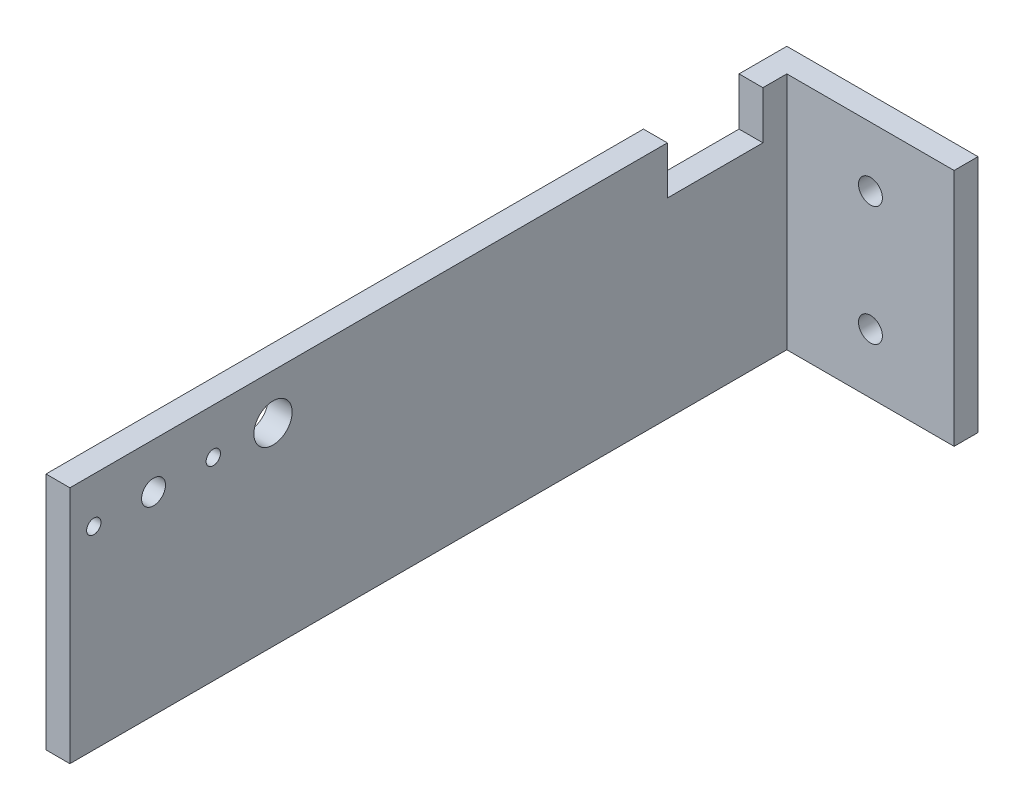
ISO-10303-21;
HEADER;
FILE_DESCRIPTION(('STEP AP214'),'2;1');
FILE_NAME('part.step','',(''),(''),'','','');
FILE_SCHEMA(('AUTOMOTIVE_DESIGN { 1 0 10303 214 1 1 1 1 }'));
ENDSEC;
DATA;
#1=APPLICATION_CONTEXT('core data for automotive mechanical design processes');
#2=APPLICATION_PROTOCOL_DEFINITION('international standard','automotive_design',2000,#1);
#3=PRODUCT_CONTEXT('',#1,'mechanical');
#4=PRODUCT('Part','Part','',(#3));
#5=PRODUCT_RELATED_PRODUCT_CATEGORY('part','',(#4));
#6=PRODUCT_DEFINITION_FORMATION('','',#4);
#7=PRODUCT_DEFINITION_CONTEXT('part definition',#1,'design');
#8=PRODUCT_DEFINITION('design','',#6,#7);
#9=PRODUCT_DEFINITION_SHAPE('','',#8);
#10=(LENGTH_UNIT() NAMED_UNIT(*) SI_UNIT(.MILLI.,.METRE.));
#11=(NAMED_UNIT(*) PLANE_ANGLE_UNIT() SI_UNIT($,.RADIAN.));
#12=(NAMED_UNIT(*) SI_UNIT($,.STERADIAN.) SOLID_ANGLE_UNIT());
#13=UNCERTAINTY_MEASURE_WITH_UNIT(LENGTH_MEASURE(1.E-05),#10,'distance_accuracy_value','');
#14=(GEOMETRIC_REPRESENTATION_CONTEXT(3) GLOBAL_UNCERTAINTY_ASSIGNED_CONTEXT((#13)) GLOBAL_UNIT_ASSIGNED_CONTEXT((#10,
#11,#12)) REPRESENTATION_CONTEXT('',''));
#15=CARTESIAN_POINT('',(0.,0.,0.));
#16=DIRECTION('',(0.,0.,1.));
#17=DIRECTION('',(1.,0.,0.));
#18=AXIS2_PLACEMENT_3D('',#15,#16,#17);
#19=CARTESIAN_POINT('',(0.,25.,0.));
#20=DIRECTION('',(0.,1.,0.));
#21=DIRECTION('',(0.,0.,1.));
#22=AXIS2_PLACEMENT_3D('',#19,#20,#21);
#23=PLANE('',#22);
#24=DIRECTION('',(1.,0.,0.));
#25=VECTOR('',#24,1.);
#26=CARTESIAN_POINT('',(-0.00100000000000013,25.,-145.));
#27=LINE('',#26,#25);
#28=CARTESIAN_POINT('',(0.,25.,-145.));
#29=VERTEX_POINT('',#28);
#30=CARTESIAN_POINT('',(5.00000000000002,25.,-145.));
#31=VERTEX_POINT('',#30);
#32=EDGE_CURVE('E194',#29,#31,#27,.T.);
#33=ORIENTED_EDGE('',*,*,#32,.T.);
#34=DIRECTION('',(0.,0.,-1.));
#35=VECTOR('',#34,1.);
#36=CARTESIAN_POINT('',(5.00000000000002,25.,0.));
#37=LINE('',#36,#35);
#38=CARTESIAN_POINT('',(5.00000000000002,25.,-150.));
#39=VERTEX_POINT('',#38);
#40=EDGE_CURVE('E109',#31,#39,#37,.T.);
#41=ORIENTED_EDGE('',*,*,#40,.T.);
#42=DIRECTION('',(1.,0.,0.));
#43=VECTOR('',#42,1.);
#44=CARTESIAN_POINT('',(5.00000000000002,25.,-150.));
#45=LINE('',#44,#43);
#46=CARTESIAN_POINT('',(40.,25.,-150.));
#47=VERTEX_POINT('',#46);
#48=EDGE_CURVE('E102',#39,#47,#45,.T.);
#49=ORIENTED_EDGE('',*,*,#48,.T.);
#50=DIRECTION('',(0.,0.,-1.));
#51=VECTOR('',#50,1.);
#52=CARTESIAN_POINT('',(40.,25.,-150.));
#53=LINE('',#52,#51);
#54=CARTESIAN_POINT('',(40.,25.,-155.));
#55=VERTEX_POINT('',#54);
#56=EDGE_CURVE('E106',#47,#55,#53,.T.);
#57=ORIENTED_EDGE('',*,*,#56,.T.);
#58=DIRECTION('',(-1.,0.,0.));
#59=VECTOR('',#58,1.);
#60=CARTESIAN_POINT('',(40.,25.,-155.));
#61=LINE('',#60,#59);
#62=CARTESIAN_POINT('',(0.,25.,-155.));
#63=VERTEX_POINT('',#62);
#64=EDGE_CURVE('E57',#55,#63,#61,.T.);
#65=ORIENTED_EDGE('',*,*,#64,.T.);
#66=DIRECTION('',(0.,0.,1.));
#67=VECTOR('',#66,1.);
#68=CARTESIAN_POINT('',(0.,25.,-155.));
#69=LINE('',#68,#67);
#70=EDGE_CURVE('E161',#63,#29,#69,.T.);
#71=ORIENTED_EDGE('',*,*,#70,.T.);
#72=EDGE_LOOP('',(#33,#41,#49,#57,#65,#71));
#73=FACE_BOUND('',#72,.T.);
#74=ADVANCED_FACE('F33',(#73),#23,.T.);
#75=CARTESIAN_POINT('',(0.,25.,-155.));
#76=DIRECTION('',(1.,0.,0.));
#77=DIRECTION('',(0.,0.,-1.));
#78=AXIS2_PLACEMENT_3D('',#75,#76,#77);
#79=PLANE('',#78);
#80=CARTESIAN_POINT('',(0.,15.5,-5.));
#81=DIRECTION('',(1.,0.,0.));
#82=DIRECTION('',(0.,0.,-1.));
#83=AXIS2_PLACEMENT_3D('',#80,#81,#82);
#84=CIRCLE('',#83,1.5);
#85=CARTESIAN_POINT('',(0.,15.5,-6.5));
#86=VERTEX_POINT('',#85);
#87=EDGE_CURVE('E135',#86,#86,#84,.F.);
#88=ORIENTED_EDGE('',*,*,#87,.F.);
#89=EDGE_LOOP('',(#88));
#90=FACE_BOUND('',#89,.T.);
#91=CARTESIAN_POINT('',(0.,15.5,-17.5));
#92=DIRECTION('',(1.,0.,0.));
#93=DIRECTION('',(0.,0.,-1.));
#94=AXIS2_PLACEMENT_3D('',#91,#92,#93);
#95=CIRCLE('',#94,2.5);
#96=CARTESIAN_POINT('',(0.,15.5,-20.));
#97=VERTEX_POINT('',#96);
#98=EDGE_CURVE('E226',#97,#97,#95,.F.);
#99=ORIENTED_EDGE('',*,*,#98,.F.);
#100=EDGE_LOOP('',(#99));
#101=FACE_BOUND('',#100,.T.);
#102=CARTESIAN_POINT('',(0.,15.5,-30.));
#103=DIRECTION('',(1.,0.,0.));
#104=DIRECTION('',(0.,0.,-1.));
#105=AXIS2_PLACEMENT_3D('',#102,#103,#104);
#106=CIRCLE('',#105,1.50000000000001);
#107=CARTESIAN_POINT('',(0.,15.5,-31.5));
#108=VERTEX_POINT('',#107);
#109=EDGE_CURVE('E220',#108,#108,#106,.F.);
#110=ORIENTED_EDGE('',*,*,#109,.F.);
#111=EDGE_LOOP('',(#110));
#112=FACE_BOUND('',#111,.T.);
#113=CARTESIAN_POINT('',(0.,15.5,-42.5));
#114=DIRECTION('',(1.,0.,0.));
#115=DIRECTION('',(0.,0.,-1.));
#116=AXIS2_PLACEMENT_3D('',#113,#114,#115);
#117=CIRCLE('',#116,4.);
#118=CARTESIAN_POINT('',(0.,15.5,-46.5));
#119=VERTEX_POINT('',#118);
#120=EDGE_CURVE('E214',#119,#119,#117,.F.);
#121=ORIENTED_EDGE('',*,*,#120,.F.);
#122=EDGE_LOOP('',(#121));
#123=FACE_BOUND('',#122,.T.);
#124=DIRECTION('',(0.,0.,1.));
#125=VECTOR('',#124,1.);
#126=CARTESIAN_POINT('',(0.,15.,-125.));
#127=LINE('',#126,#125);
#128=CARTESIAN_POINT('',(0.,15.,-145.));
#129=VERTEX_POINT('',#128);
#130=CARTESIAN_POINT('',(0.,15.,-125.));
#131=VERTEX_POINT('',#130);
#132=EDGE_CURVE('E211',#129,#131,#127,.T.);
#133=ORIENTED_EDGE('',*,*,#132,.F.);
#134=DIRECTION('',(0.,-1.,0.));
#135=VECTOR('',#134,1.);
#136=CARTESIAN_POINT('',(0.,15.,-145.));
#137=LINE('',#136,#135);
#138=EDGE_CURVE('E164',#29,#129,#137,.T.);
#139=ORIENTED_EDGE('',*,*,#138,.F.);
#140=ORIENTED_EDGE('',*,*,#70,.F.);
#141=DIRECTION('',(0.,-1.,0.));
#142=VECTOR('',#141,1.);
#143=CARTESIAN_POINT('',(0.,25.,-155.));
#144=LINE('',#143,#142);
#145=CARTESIAN_POINT('',(0.,-25.,-155.));
#146=VERTEX_POINT('',#145);
#147=EDGE_CURVE('E127',#63,#146,#144,.T.);
#148=ORIENTED_EDGE('',*,*,#147,.T.);
#149=DIRECTION('',(0.,0.,1.));
#150=VECTOR('',#149,1.);
#151=CARTESIAN_POINT('',(0.,-25.,-155.));
#152=LINE('',#151,#150);
#153=CARTESIAN_POINT('',(0.,-25.,0.));
#154=VERTEX_POINT('',#153);
#155=EDGE_CURVE('E131',#146,#154,#152,.T.);
#156=ORIENTED_EDGE('',*,*,#155,.T.);
#157=DIRECTION('',(0.,-1.,0.));
#158=VECTOR('',#157,1.);
#159=CARTESIAN_POINT('',(0.,25.,0.));
#160=LINE('',#159,#158);
#161=CARTESIAN_POINT('',(0.,25.,0.));
#162=VERTEX_POINT('',#161);
#163=EDGE_CURVE('E11',#162,#154,#160,.T.);
#164=ORIENTED_EDGE('',*,*,#163,.F.);
#165=CARTESIAN_POINT('',(0.,25.,-125.));
#166=VERTEX_POINT('',#165);
#167=EDGE_CURVE('E92',#166,#162,#69,.T.);
#168=ORIENTED_EDGE('',*,*,#167,.F.);
#169=DIRECTION('',(0.,1.,0.));
#170=VECTOR('',#169,1.);
#171=CARTESIAN_POINT('',(0.,25.,-125.));
#172=LINE('',#171,#170);
#173=EDGE_CURVE('E48',#131,#166,#172,.T.);
#174=ORIENTED_EDGE('',*,*,#173,.F.);
#175=EDGE_LOOP('',(#133,#139,#140,#148,#156,#164,#168,#174));
#176=FACE_BOUND('',#175,.T.);
#177=ADVANCED_FACE('F35',(#90,#101,#112,#123,#176),#79,.F.);
#178=CARTESIAN_POINT('',(0.,25.,0.));
#179=DIRECTION('',(0.,0.,-1.));
#180=DIRECTION('',(-1.,0.,0.));
#181=AXIS2_PLACEMENT_3D('',#178,#179,#180);
#182=PLANE('',#181);
#183=DIRECTION('',(1.,0.,0.));
#184=VECTOR('',#183,1.);
#185=CARTESIAN_POINT('',(0.,-25.,0.));
#186=LINE('',#185,#184);
#187=CARTESIAN_POINT('',(5.00000000000002,-25.,0.));
#188=VERTEX_POINT('',#187);
#189=EDGE_CURVE('E134',#154,#188,#186,.T.);
#190=ORIENTED_EDGE('',*,*,#189,.T.);
#191=DIRECTION('',(0.,-1.,0.));
#192=VECTOR('',#191,1.);
#193=CARTESIAN_POINT('',(5.00000000000002,25.,0.));
#194=LINE('',#193,#192);
#195=CARTESIAN_POINT('',(5.00000000000002,25.,0.));
#196=VERTEX_POINT('',#195);
#197=EDGE_CURVE('E41',#196,#188,#194,.T.);
#198=ORIENTED_EDGE('',*,*,#197,.F.);
#199=DIRECTION('',(1.,0.,0.));
#200=VECTOR('',#199,1.);
#201=CARTESIAN_POINT('',(0.,25.,0.));
#202=LINE('',#201,#200);
#203=EDGE_CURVE('E165',#162,#196,#202,.T.);
#204=ORIENTED_EDGE('',*,*,#203,.F.);
#205=ORIENTED_EDGE('',*,*,#163,.T.);
#206=EDGE_LOOP('',(#190,#198,#204,#205));
#207=FACE_BOUND('',#206,.T.);
#208=ADVANCED_FACE('F279',(#207),#182,.F.);
#209=CARTESIAN_POINT('',(5.00000000000002,25.,0.));
#210=DIRECTION('',(-1.,0.,0.));
#211=DIRECTION('',(0.,0.,1.));
#212=AXIS2_PLACEMENT_3D('',#209,#210,#211);
#213=PLANE('',#212);
#214=CARTESIAN_POINT('',(5.00000000000002,15.5,-5.));
#215=DIRECTION('',(1.,0.,0.));
#216=DIRECTION('',(0.,0.,-1.));
#217=AXIS2_PLACEMENT_3D('',#214,#215,#216);
#218=CIRCLE('',#217,1.5);
#219=CARTESIAN_POINT('',(5.00000000000002,15.5,-6.5));
#220=VERTEX_POINT('',#219);
#221=EDGE_CURVE('E229',#220,#220,#218,.T.);
#222=ORIENTED_EDGE('',*,*,#221,.F.);
#223=EDGE_LOOP('',(#222));
#224=FACE_BOUND('',#223,.T.);
#225=CARTESIAN_POINT('',(5.00000000000002,15.5,-17.5));
#226=DIRECTION('',(1.,0.,0.));
#227=DIRECTION('',(0.,0.,-1.));
#228=AXIS2_PLACEMENT_3D('',#225,#226,#227);
#229=CIRCLE('',#228,2.5);
#230=CARTESIAN_POINT('',(5.00000000000002,15.5,-20.));
#231=VERTEX_POINT('',#230);
#232=EDGE_CURVE('E223',#231,#231,#229,.T.);
#233=ORIENTED_EDGE('',*,*,#232,.F.);
#234=EDGE_LOOP('',(#233));
#235=FACE_BOUND('',#234,.T.);
#236=CARTESIAN_POINT('',(5.00000000000002,15.5,-30.));
#237=DIRECTION('',(1.,0.,0.));
#238=DIRECTION('',(0.,0.,-1.));
#239=AXIS2_PLACEMENT_3D('',#236,#237,#238);
#240=CIRCLE('',#239,1.50000000000001);
#241=CARTESIAN_POINT('',(5.00000000000002,15.5,-31.5));
#242=VERTEX_POINT('',#241);
#243=EDGE_CURVE('E217',#242,#242,#240,.T.);
#244=ORIENTED_EDGE('',*,*,#243,.F.);
#245=EDGE_LOOP('',(#244));
#246=FACE_BOUND('',#245,.T.);
#247=CARTESIAN_POINT('',(5.00000000000002,15.5,-42.5));
#248=DIRECTION('',(1.,0.,0.));
#249=DIRECTION('',(0.,0.,-1.));
#250=AXIS2_PLACEMENT_3D('',#247,#248,#249);
#251=CIRCLE('',#250,4.);
#252=CARTESIAN_POINT('',(5.00000000000002,15.5,-46.5));
#253=VERTEX_POINT('',#252);
#254=EDGE_CURVE('E199',#253,#253,#251,.T.);
#255=ORIENTED_EDGE('',*,*,#254,.F.);
#256=EDGE_LOOP('',(#255));
#257=FACE_BOUND('',#256,.T.);
#258=ORIENTED_EDGE('',*,*,#40,.F.);
#259=DIRECTION('',(0.,1.,0.));
#260=VECTOR('',#259,1.);
#261=CARTESIAN_POINT('',(5.00000000000002,15.,-145.));
#262=LINE('',#261,#260);
#263=CARTESIAN_POINT('',(5.00000000000002,15.,-145.));
#264=VERTEX_POINT('',#263);
#265=EDGE_CURVE('E197',#264,#31,#262,.T.);
#266=ORIENTED_EDGE('',*,*,#265,.F.);
#267=DIRECTION('',(0.,0.,-1.));
#268=VECTOR('',#267,1.);
#269=CARTESIAN_POINT('',(5.00000000000002,15.,-125.));
#270=LINE('',#269,#268);
#271=CARTESIAN_POINT('',(5.00000000000002,15.,-125.));
#272=VERTEX_POINT('',#271);
#273=EDGE_CURVE('E205',#272,#264,#270,.T.);
#274=ORIENTED_EDGE('',*,*,#273,.F.);
#275=DIRECTION('',(0.,-1.,0.));
#276=VECTOR('',#275,1.);
#277=CARTESIAN_POINT('',(5.00000000000002,25.,-125.));
#278=LINE('',#277,#276);
#279=CARTESIAN_POINT('',(5.00000000000002,25.,-125.));
#280=VERTEX_POINT('',#279);
#281=EDGE_CURVE('E206',#280,#272,#278,.T.);
#282=ORIENTED_EDGE('',*,*,#281,.F.);
#283=EDGE_CURVE('E113',#196,#280,#37,.T.);
#284=ORIENTED_EDGE('',*,*,#283,.F.);
#285=ORIENTED_EDGE('',*,*,#197,.T.);
#286=DIRECTION('',(0.,0.,-1.));
#287=VECTOR('',#286,1.);
#288=CARTESIAN_POINT('',(5.00000000000002,-25.,0.));
#289=LINE('',#288,#287);
#290=CARTESIAN_POINT('',(5.00000000000002,-25.,-150.));
#291=VERTEX_POINT('',#290);
#292=EDGE_CURVE('E137',#188,#291,#289,.T.);
#293=ORIENTED_EDGE('',*,*,#292,.T.);
#294=DIRECTION('',(0.,-1.,0.));
#295=VECTOR('',#294,1.);
#296=CARTESIAN_POINT('',(5.00000000000002,25.,-150.));
#297=LINE('',#296,#295);
#298=EDGE_CURVE('E122',#39,#291,#297,.T.);
#299=ORIENTED_EDGE('',*,*,#298,.F.);
#300=EDGE_LOOP('',(#258,#266,#274,#282,#284,#285,#293,#299));
#301=FACE_BOUND('',#300,.T.);
#302=ADVANCED_FACE('F150',(#224,#235,#246,#257,#301),#213,.F.);
#303=CARTESIAN_POINT('',(5.00000000000002,25.,-150.));
#304=DIRECTION('',(0.,0.,-1.));
#305=DIRECTION('',(-1.,0.,0.));
#306=AXIS2_PLACEMENT_3D('',#303,#304,#305);
#307=PLANE('',#306);
#308=CARTESIAN_POINT('',(22.5,12.5,-150.));
#309=DIRECTION('',(0.,0.,1.));
#310=DIRECTION('',(1.,0.,0.));
#311=AXIS2_PLACEMENT_3D('',#308,#309,#310);
#312=CIRCLE('',#311,2.5);
#313=CARTESIAN_POINT('',(25.,12.5,-150.));
#314=VERTEX_POINT('',#313);
#315=EDGE_CURVE('E239',#314,#314,#312,.T.);
#316=ORIENTED_EDGE('',*,*,#315,.F.);
#317=EDGE_LOOP('',(#316));
#318=FACE_BOUND('',#317,.T.);
#319=CARTESIAN_POINT('',(22.5,-12.5,-150.));
#320=DIRECTION('',(0.,0.,1.));
#321=DIRECTION('',(-1.,0.,0.));
#322=AXIS2_PLACEMENT_3D('',#319,#320,#321);
#323=CIRCLE('',#322,2.5);
#324=CARTESIAN_POINT('',(20.,-12.5,-150.));
#325=VERTEX_POINT('',#324);
#326=EDGE_CURVE('E240',#325,#325,#323,.T.);
#327=ORIENTED_EDGE('',*,*,#326,.F.);
#328=EDGE_LOOP('',(#327));
#329=FACE_BOUND('',#328,.T.);
#330=DIRECTION('',(1.,0.,0.));
#331=VECTOR('',#330,1.);
#332=CARTESIAN_POINT('',(5.00000000000002,-25.,-150.));
#333=LINE('',#332,#331);
#334=CARTESIAN_POINT('',(40.,-25.,-150.));
#335=VERTEX_POINT('',#334);
#336=EDGE_CURVE('E119',#291,#335,#333,.T.);
#337=ORIENTED_EDGE('',*,*,#336,.T.);
#338=DIRECTION('',(0.,-1.,0.));
#339=VECTOR('',#338,1.);
#340=CARTESIAN_POINT('',(40.,25.,-150.));
#341=LINE('',#340,#339);
#342=EDGE_CURVE('E116',#47,#335,#341,.T.);
#343=ORIENTED_EDGE('',*,*,#342,.F.);
#344=ORIENTED_EDGE('',*,*,#48,.F.);
#345=ORIENTED_EDGE('',*,*,#298,.T.);
#346=EDGE_LOOP('',(#337,#343,#344,#345));
#347=FACE_BOUND('',#346,.T.);
#348=ADVANCED_FACE('F117',(#318,#329,#347),#307,.F.);
#349=CARTESIAN_POINT('',(40.,25.,-150.));
#350=DIRECTION('',(-1.,0.,0.));
#351=DIRECTION('',(0.,0.,1.));
#352=AXIS2_PLACEMENT_3D('',#349,#350,#351);
#353=PLANE('',#352);
#354=DIRECTION('',(0.,0.,-1.));
#355=VECTOR('',#354,1.);
#356=CARTESIAN_POINT('',(40.,-25.,-150.));
#357=LINE('',#356,#355);
#358=CARTESIAN_POINT('',(40.,-25.,-155.));
#359=VERTEX_POINT('',#358);
#360=EDGE_CURVE('E140',#335,#359,#357,.T.);
#361=ORIENTED_EDGE('',*,*,#360,.T.);
#362=DIRECTION('',(0.,-1.,0.));
#363=VECTOR('',#362,1.);
#364=CARTESIAN_POINT('',(40.,25.,-155.));
#365=LINE('',#364,#363);
#366=EDGE_CURVE('E123',#55,#359,#365,.T.);
#367=ORIENTED_EDGE('',*,*,#366,.F.);
#368=ORIENTED_EDGE('',*,*,#56,.F.);
#369=ORIENTED_EDGE('',*,*,#342,.T.);
#370=EDGE_LOOP('',(#361,#367,#368,#369));
#371=FACE_BOUND('',#370,.T.);
#372=ADVANCED_FACE('F125',(#371),#353,.F.);
#373=CARTESIAN_POINT('',(40.,25.,-155.));
#374=DIRECTION('',(0.,0.,1.));
#375=DIRECTION('',(1.,0.,0.));
#376=AXIS2_PLACEMENT_3D('',#373,#374,#375);
#377=PLANE('',#376);
#378=CARTESIAN_POINT('',(22.5,12.5,-155.));
#379=DIRECTION('',(0.,0.,1.));
#380=DIRECTION('',(1.,0.,0.));
#381=AXIS2_PLACEMENT_3D('',#378,#379,#380);
#382=CIRCLE('',#381,2.5);
#383=CARTESIAN_POINT('',(25.,12.5,-155.));
#384=VERTEX_POINT('',#383);
#385=EDGE_CURVE('E213',#384,#384,#382,.F.);
#386=ORIENTED_EDGE('',*,*,#385,.F.);
#387=EDGE_LOOP('',(#386));
#388=FACE_BOUND('',#387,.T.);
#389=CARTESIAN_POINT('',(22.5,-12.5,-155.));
#390=DIRECTION('',(0.,0.,1.));
#391=DIRECTION('',(1.,0.,0.));
#392=AXIS2_PLACEMENT_3D('',#389,#390,#391);
#393=CIRCLE('',#392,2.5);
#394=CARTESIAN_POINT('',(25.,-12.5,-155.));
#395=VERTEX_POINT('',#394);
#396=EDGE_CURVE('E236',#395,#395,#393,.F.);
#397=ORIENTED_EDGE('',*,*,#396,.F.);
#398=EDGE_LOOP('',(#397));
#399=FACE_BOUND('',#398,.T.);
#400=DIRECTION('',(-1.,0.,0.));
#401=VECTOR('',#400,1.);
#402=CARTESIAN_POINT('',(40.,-25.,-155.));
#403=LINE('',#402,#401);
#404=EDGE_CURVE('E84',#359,#146,#403,.T.);
#405=ORIENTED_EDGE('',*,*,#404,.T.);
#406=ORIENTED_EDGE('',*,*,#147,.F.);
#407=ORIENTED_EDGE('',*,*,#64,.F.);
#408=ORIENTED_EDGE('',*,*,#366,.T.);
#409=EDGE_LOOP('',(#405,#406,#407,#408));
#410=FACE_BOUND('',#409,.T.);
#411=ADVANCED_FACE('F157',(#388,#399,#410),#377,.F.);
#412=DIRECTION('',(1.,0.,0.));
#413=VECTOR('',#412,1.);
#414=CARTESIAN_POINT('',(-0.00100000000000013,25.,-125.));
#415=LINE('',#414,#413);
#416=EDGE_CURVE('E172',#166,#280,#415,.T.);
#417=ORIENTED_EDGE('',*,*,#416,.F.);
#418=ORIENTED_EDGE('',*,*,#167,.T.);
#419=ORIENTED_EDGE('',*,*,#203,.T.);
#420=ORIENTED_EDGE('',*,*,#283,.T.);
#421=EDGE_LOOP('',(#417,#418,#419,#420));
#422=FACE_BOUND('',#421,.T.);
#423=ADVANCED_FACE('F171',(#422),#23,.T.);
#424=CARTESIAN_POINT('',(0.,-25.,0.));
#425=DIRECTION('',(0.,1.,0.));
#426=DIRECTION('',(0.,0.,1.));
#427=AXIS2_PLACEMENT_3D('',#424,#425,#426);
#428=PLANE('',#427);
#429=ORIENTED_EDGE('',*,*,#155,.F.);
#430=ORIENTED_EDGE('',*,*,#404,.F.);
#431=ORIENTED_EDGE('',*,*,#360,.F.);
#432=ORIENTED_EDGE('',*,*,#336,.F.);
#433=ORIENTED_EDGE('',*,*,#292,.F.);
#434=ORIENTED_EDGE('',*,*,#189,.F.);
#435=EDGE_LOOP('',(#429,#430,#431,#432,#433,#434));
#436=FACE_BOUND('',#435,.T.);
#437=ADVANCED_FACE('F156',(#436),#428,.F.);
#438=CARTESIAN_POINT('',(-0.00100000000000013,15.,-145.));
#439=DIRECTION('',(0.,0.,-1.));
#440=DIRECTION('',(-1.,0.,0.));
#441=AXIS2_PLACEMENT_3D('',#438,#439,#440);
#442=PLANE('',#441);
#443=ORIENTED_EDGE('',*,*,#138,.T.);
#444=DIRECTION('',(1.,0.,0.));
#445=VECTOR('',#444,1.);
#446=CARTESIAN_POINT('',(-0.00100000000000013,15.,-145.));
#447=LINE('',#446,#445);
#448=EDGE_CURVE('E191',#129,#264,#447,.T.);
#449=ORIENTED_EDGE('',*,*,#448,.T.);
#450=ORIENTED_EDGE('',*,*,#265,.T.);
#451=ORIENTED_EDGE('',*,*,#32,.F.);
#452=EDGE_LOOP('',(#443,#449,#450,#451));
#453=FACE_BOUND('',#452,.T.);
#454=ADVANCED_FACE('F195',(#453),#442,.F.);
#455=CARTESIAN_POINT('',(-0.00100000000000013,15.,-125.));
#456=DIRECTION('',(0.,-1.,0.));
#457=DIRECTION('',(0.,0.,-1.));
#458=AXIS2_PLACEMENT_3D('',#455,#456,#457);
#459=PLANE('',#458);
#460=ORIENTED_EDGE('',*,*,#132,.T.);
#461=DIRECTION('',(1.,0.,0.));
#462=VECTOR('',#461,1.);
#463=CARTESIAN_POINT('',(-0.00100000000000013,15.,-125.));
#464=LINE('',#463,#462);
#465=EDGE_CURVE('E200',#131,#272,#464,.T.);
#466=ORIENTED_EDGE('',*,*,#465,.T.);
#467=ORIENTED_EDGE('',*,*,#273,.T.);
#468=ORIENTED_EDGE('',*,*,#448,.F.);
#469=EDGE_LOOP('',(#460,#466,#467,#468));
#470=FACE_BOUND('',#469,.T.);
#471=ADVANCED_FACE('F288',(#470),#459,.F.);
#472=CARTESIAN_POINT('',(-0.00100000000000013,25.,-125.));
#473=DIRECTION('',(0.,0.,1.));
#474=DIRECTION('',(1.,0.,0.));
#475=AXIS2_PLACEMENT_3D('',#472,#473,#474);
#476=PLANE('',#475);
#477=ORIENTED_EDGE('',*,*,#173,.T.);
#478=ORIENTED_EDGE('',*,*,#416,.T.);
#479=ORIENTED_EDGE('',*,*,#281,.T.);
#480=ORIENTED_EDGE('',*,*,#465,.F.);
#481=EDGE_LOOP('',(#477,#478,#479,#480));
#482=FACE_BOUND('',#481,.T.);
#483=ADVANCED_FACE('F282',(#482),#476,.F.);
#484=CARTESIAN_POINT('',(-0.00100000000000013,15.5,-42.5));
#485=DIRECTION('',(1.,0.,0.));
#486=DIRECTION('',(0.,0.,-1.));
#487=AXIS2_PLACEMENT_3D('',#484,#485,#486);
#488=CYLINDRICAL_SURFACE('',#487,4.);
#489=ORIENTED_EDGE('',*,*,#254,.T.);
#490=EDGE_LOOP('',(#489));
#491=FACE_BOUND('',#490,.T.);
#492=ORIENTED_EDGE('',*,*,#120,.T.);
#493=EDGE_LOOP('',(#492));
#494=FACE_BOUND('',#493,.T.);
#495=ADVANCED_FACE('F294',(#491,#494),#488,.F.);
#496=CARTESIAN_POINT('',(-0.00100000000000013,15.5,-30.));
#497=DIRECTION('',(1.,0.,0.));
#498=DIRECTION('',(0.,0.,-1.));
#499=AXIS2_PLACEMENT_3D('',#496,#497,#498);
#500=CYLINDRICAL_SURFACE('',#499,1.50000000000001);
#501=ORIENTED_EDGE('',*,*,#243,.T.);
#502=EDGE_LOOP('',(#501));
#503=FACE_BOUND('',#502,.T.);
#504=ORIENTED_EDGE('',*,*,#109,.T.);
#505=EDGE_LOOP('',(#504));
#506=FACE_BOUND('',#505,.T.);
#507=ADVANCED_FACE('F297',(#503,#506),#500,.F.);
#508=CARTESIAN_POINT('',(-0.00100000000000013,15.5,-17.5));
#509=DIRECTION('',(1.,0.,0.));
#510=DIRECTION('',(0.,0.,-1.));
#511=AXIS2_PLACEMENT_3D('',#508,#509,#510);
#512=CYLINDRICAL_SURFACE('',#511,2.5);
#513=ORIENTED_EDGE('',*,*,#232,.T.);
#514=EDGE_LOOP('',(#513));
#515=FACE_BOUND('',#514,.T.);
#516=ORIENTED_EDGE('',*,*,#98,.T.);
#517=EDGE_LOOP('',(#516));
#518=FACE_BOUND('',#517,.T.);
#519=ADVANCED_FACE('F301',(#515,#518),#512,.F.);
#520=CARTESIAN_POINT('',(-0.00100000000000013,15.5,-5.));
#521=DIRECTION('',(1.,0.,0.));
#522=DIRECTION('',(0.,0.,-1.));
#523=AXIS2_PLACEMENT_3D('',#520,#521,#522);
#524=CYLINDRICAL_SURFACE('',#523,1.5);
#525=ORIENTED_EDGE('',*,*,#221,.T.);
#526=EDGE_LOOP('',(#525));
#527=FACE_BOUND('',#526,.T.);
#528=ORIENTED_EDGE('',*,*,#87,.T.);
#529=EDGE_LOOP('',(#528));
#530=FACE_BOUND('',#529,.T.);
#531=ADVANCED_FACE('F259',(#527,#530),#524,.F.);
#532=CARTESIAN_POINT('',(22.5,-12.5,-155.001));
#533=DIRECTION('',(0.,0.,1.));
#534=DIRECTION('',(1.,0.,0.));
#535=AXIS2_PLACEMENT_3D('',#532,#533,#534);
#536=CYLINDRICAL_SURFACE('',#535,2.5);
#537=ORIENTED_EDGE('',*,*,#326,.T.);
#538=EDGE_LOOP('',(#537));
#539=FACE_BOUND('',#538,.T.);
#540=ORIENTED_EDGE('',*,*,#396,.T.);
#541=EDGE_LOOP('',(#540));
#542=FACE_BOUND('',#541,.T.);
#543=ADVANCED_FACE('F256',(#539,#542),#536,.F.);
#544=CARTESIAN_POINT('',(22.5,12.5,-155.001));
#545=DIRECTION('',(0.,0.,1.));
#546=DIRECTION('',(1.,0.,0.));
#547=AXIS2_PLACEMENT_3D('',#544,#545,#546);
#548=CYLINDRICAL_SURFACE('',#547,2.5);
#549=ORIENTED_EDGE('',*,*,#315,.T.);
#550=EDGE_LOOP('',(#549));
#551=FACE_BOUND('',#550,.T.);
#552=ORIENTED_EDGE('',*,*,#385,.T.);
#553=EDGE_LOOP('',(#552));
#554=FACE_BOUND('',#553,.T.);
#555=ADVANCED_FACE('F248',(#551,#554),#548,.F.);
#556=CLOSED_SHELL('',(#74,#177,#208,#302,#348,#372,#411,#423,#437,#454,#471,#483,#495,#507,#519,
#531,#543,#555));
#557=MANIFOLD_SOLID_BREP('B2',#556);
#558=ADVANCED_BREP_SHAPE_REPRESENTATION('',(#18,#557),#14);
#559=SHAPE_DEFINITION_REPRESENTATION(#9,#558);
ENDSEC;
END-ISO-10303-21;
